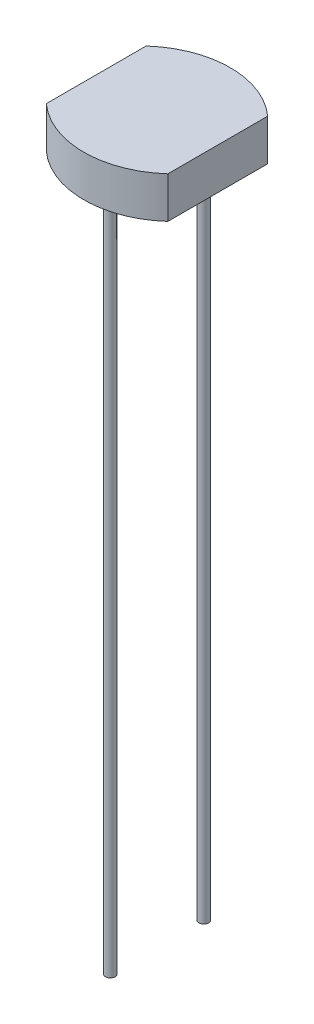
ISO-10303-21;
HEADER;
FILE_DESCRIPTION(('STEP AP214'),'2;1');
FILE_NAME('part.step','',(''),(''),'','','');
FILE_SCHEMA(('AUTOMOTIVE_DESIGN { 1 0 10303 214 1 1 1 1 }'));
ENDSEC;
DATA;
#1=APPLICATION_CONTEXT('core data for automotive mechanical design processes');
#2=APPLICATION_PROTOCOL_DEFINITION('international standard','automotive_design',2000,#1);
#3=PRODUCT_CONTEXT('',#1,'mechanical');
#4=PRODUCT('Part','Part','',(#3));
#5=PRODUCT_RELATED_PRODUCT_CATEGORY('part','',(#4));
#6=PRODUCT_DEFINITION_FORMATION('','',#4);
#7=PRODUCT_DEFINITION_CONTEXT('part definition',#1,'design');
#8=PRODUCT_DEFINITION('design','',#6,#7);
#9=PRODUCT_DEFINITION_SHAPE('','',#8);
#10=(LENGTH_UNIT() NAMED_UNIT(*) SI_UNIT(.MILLI.,.METRE.));
#11=(NAMED_UNIT(*) PLANE_ANGLE_UNIT() SI_UNIT($,.RADIAN.));
#12=(NAMED_UNIT(*) SI_UNIT($,.STERADIAN.) SOLID_ANGLE_UNIT());
#13=UNCERTAINTY_MEASURE_WITH_UNIT(LENGTH_MEASURE(1.E-05),#10,'distance_accuracy_value','');
#14=(GEOMETRIC_REPRESENTATION_CONTEXT(3) GLOBAL_UNCERTAINTY_ASSIGNED_CONTEXT((#13)) GLOBAL_UNIT_ASSIGNED_CONTEXT((#10,
#11,#12)) REPRESENTATION_CONTEXT('',''));
#15=CARTESIAN_POINT('',(0.,0.,0.));
#16=DIRECTION('',(0.,0.,1.));
#17=DIRECTION('',(1.,0.,0.));
#18=AXIS2_PLACEMENT_3D('',#15,#16,#17);
#19=CARTESIAN_POINT('',(2.80000000000001,1.9,0.));
#20=DIRECTION('',(-1.,0.,0.));
#21=DIRECTION('',(0.,0.,1.));
#22=AXIS2_PLACEMENT_3D('',#19,#20,#21);
#23=PLANE('',#22);
#24=DIRECTION('',(0.,0.,-1.));
#25=VECTOR('',#24,1.);
#26=CARTESIAN_POINT('',(2.80000000000001,0.,0.));
#27=LINE('',#26,#25);
#28=CARTESIAN_POINT('',(2.80000000000001,0.,2.29893702585345));
#29=VERTEX_POINT('',#28);
#30=CARTESIAN_POINT('',(2.80000000000001,0.,-2.29893702585345));
#31=VERTEX_POINT('',#30);
#32=EDGE_CURVE('E79',#29,#31,#27,.T.);
#33=ORIENTED_EDGE('',*,*,#32,.T.);
#34=DIRECTION('',(0.,-1.,0.));
#35=VECTOR('',#34,1.);
#36=CARTESIAN_POINT('',(2.80000000000001,1.9,-2.29893702585345));
#37=LINE('',#36,#35);
#38=CARTESIAN_POINT('',(2.80000000000001,1.9,-2.29893702585345));
#39=VERTEX_POINT('',#38);
#40=EDGE_CURVE('E42',#39,#31,#37,.T.);
#41=ORIENTED_EDGE('',*,*,#40,.F.);
#42=DIRECTION('',(0.,0.,-1.));
#43=VECTOR('',#42,1.);
#44=CARTESIAN_POINT('',(2.80000000000001,1.9,0.));
#45=LINE('',#44,#43);
#46=CARTESIAN_POINT('',(2.80000000000001,1.9,2.29893702585345));
#47=VERTEX_POINT('',#46);
#48=EDGE_CURVE('E70',#47,#39,#45,.T.);
#49=ORIENTED_EDGE('',*,*,#48,.F.);
#50=DIRECTION('',(0.,-1.,0.));
#51=VECTOR('',#50,1.);
#52=CARTESIAN_POINT('',(2.80000000000001,1.9,2.29893702585345));
#53=LINE('',#52,#51);
#54=EDGE_CURVE('E85',#47,#29,#53,.T.);
#55=ORIENTED_EDGE('',*,*,#54,.T.);
#56=EDGE_LOOP('',(#33,#41,#49,#55));
#57=FACE_BOUND('',#56,.T.);
#58=ADVANCED_FACE('F34',(#57),#23,.F.);
#59=CARTESIAN_POINT('',(0.,1.9,0.805940958156026));
#60=DIRECTION('',(0.,-1.,0.));
#61=DIRECTION('',(0.,0.,-1.));
#62=AXIS2_PLACEMENT_3D('',#59,#60,#61);
#63=CYLINDRICAL_SURFACE('',#62,4.18094095815604);
#64=CARTESIAN_POINT('',(0.,0.,0.805940958156026));
#65=DIRECTION('',(0.,1.,0.));
#66=DIRECTION('',(0.,0.,1.));
#67=AXIS2_PLACEMENT_3D('',#64,#65,#66);
#68=CIRCLE('',#67,4.18094095815604);
#69=CARTESIAN_POINT('',(-2.79999999999999,0.,-2.29893702585345));
#70=VERTEX_POINT('',#69);
#71=EDGE_CURVE('E61',#31,#70,#68,.T.);
#72=ORIENTED_EDGE('',*,*,#71,.T.);
#73=DIRECTION('',(0.,-1.,0.));
#74=VECTOR('',#73,1.);
#75=CARTESIAN_POINT('',(-2.79999999999999,1.9,-2.29893702585345));
#76=LINE('',#75,#74);
#77=CARTESIAN_POINT('',(-2.79999999999999,1.9,-2.29893702585345));
#78=VERTEX_POINT('',#77);
#79=EDGE_CURVE('E111',#78,#70,#76,.T.);
#80=ORIENTED_EDGE('',*,*,#79,.F.);
#81=CARTESIAN_POINT('',(0.,1.9,0.805940958156026));
#82=DIRECTION('',(0.,1.,0.));
#83=DIRECTION('',(0.,0.,1.));
#84=AXIS2_PLACEMENT_3D('',#81,#82,#83);
#85=CIRCLE('',#84,4.18094095815604);
#86=EDGE_CURVE('E50',#39,#78,#85,.T.);
#87=ORIENTED_EDGE('',*,*,#86,.F.);
#88=ORIENTED_EDGE('',*,*,#40,.T.);
#89=EDGE_LOOP('',(#72,#80,#87,#88));
#90=FACE_BOUND('',#89,.T.);
#91=ADVANCED_FACE('F116',(#90),#63,.T.);
#92=CARTESIAN_POINT('',(-2.79999999999999,1.9,0.));
#93=DIRECTION('',(-1.,0.,0.));
#94=DIRECTION('',(0.,0.,1.));
#95=AXIS2_PLACEMENT_3D('',#92,#93,#94);
#96=PLANE('',#95);
#97=DIRECTION('',(0.,0.,-1.));
#98=VECTOR('',#97,1.);
#99=CARTESIAN_POINT('',(-2.79999999999999,0.,0.));
#100=LINE('',#99,#98);
#101=CARTESIAN_POINT('',(-2.79999999999999,0.,2.29893702585345));
#102=VERTEX_POINT('',#101);
#103=EDGE_CURVE('E107',#102,#70,#100,.T.);
#104=ORIENTED_EDGE('',*,*,#103,.F.);
#105=DIRECTION('',(0.,-1.,0.));
#106=VECTOR('',#105,1.);
#107=CARTESIAN_POINT('',(-2.79999999999999,1.9,2.29893702585345));
#108=LINE('',#107,#106);
#109=CARTESIAN_POINT('',(-2.79999999999999,1.9,2.29893702585345));
#110=VERTEX_POINT('',#109);
#111=EDGE_CURVE('E89',#110,#102,#108,.T.);
#112=ORIENTED_EDGE('',*,*,#111,.F.);
#113=DIRECTION('',(0.,0.,-1.));
#114=VECTOR('',#113,1.);
#115=CARTESIAN_POINT('',(-2.79999999999999,1.9,0.));
#116=LINE('',#115,#114);
#117=EDGE_CURVE('E109',#110,#78,#116,.T.);
#118=ORIENTED_EDGE('',*,*,#117,.T.);
#119=ORIENTED_EDGE('',*,*,#79,.T.);
#120=EDGE_LOOP('',(#104,#112,#118,#119));
#121=FACE_BOUND('',#120,.T.);
#122=ADVANCED_FACE('F119',(#121),#96,.T.);
#123=CARTESIAN_POINT('',(0.,1.9,0.));
#124=DIRECTION('',(0.,1.,0.));
#125=DIRECTION('',(0.,0.,1.));
#126=AXIS2_PLACEMENT_3D('',#123,#124,#125);
#127=PLANE('',#126);
#128=ORIENTED_EDGE('',*,*,#48,.T.);
#129=ORIENTED_EDGE('',*,*,#86,.T.);
#130=ORIENTED_EDGE('',*,*,#117,.F.);
#131=CARTESIAN_POINT('',(0.,1.9,-0.805940958156026));
#132=DIRECTION('',(0.,-1.,0.));
#133=DIRECTION('',(0.,0.,-1.));
#134=AXIS2_PLACEMENT_3D('',#131,#132,#133);
#135=CIRCLE('',#134,4.18094095815604);
#136=EDGE_CURVE('E90',#47,#110,#135,.T.);
#137=ORIENTED_EDGE('',*,*,#136,.F.);
#138=EDGE_LOOP('',(#128,#129,#130,#137));
#139=FACE_BOUND('',#138,.T.);
#140=ADVANCED_FACE('F117',(#139),#127,.T.);
#141=CARTESIAN_POINT('',(0.,0.,0.));
#142=DIRECTION('',(0.,1.,0.));
#143=DIRECTION('',(0.,0.,1.));
#144=AXIS2_PLACEMENT_3D('',#141,#142,#143);
#145=PLANE('',#144);
#146=CARTESIAN_POINT('',(0.,0.,2.15000000000002));
#147=DIRECTION('',(0.,1.,0.));
#148=DIRECTION('',(0.,0.,1.));
#149=AXIS2_PLACEMENT_3D('',#146,#147,#148);
#150=CIRCLE('',#149,0.225);
#151=CARTESIAN_POINT('',(0.,0.,2.37500000000002));
#152=VERTEX_POINT('',#151);
#153=EDGE_CURVE('E99',#152,#152,#150,.T.);
#154=ORIENTED_EDGE('',*,*,#153,.T.);
#155=EDGE_LOOP('',(#154));
#156=FACE_BOUND('',#155,.T.);
#157=CARTESIAN_POINT('',(0.,0.,-2.15000000000002));
#158=DIRECTION('',(0.,1.,0.));
#159=DIRECTION('',(0.,0.,1.));
#160=AXIS2_PLACEMENT_3D('',#157,#158,#159);
#161=CIRCLE('',#160,0.225);
#162=CARTESIAN_POINT('',(0.,0.,-1.92500000000002));
#163=VERTEX_POINT('',#162);
#164=EDGE_CURVE('E11',#163,#163,#161,.F.);
#165=ORIENTED_EDGE('',*,*,#164,.F.);
#166=EDGE_LOOP('',(#165));
#167=FACE_BOUND('',#166,.T.);
#168=ORIENTED_EDGE('',*,*,#32,.F.);
#169=CARTESIAN_POINT('',(0.,0.,-0.805940958156026));
#170=DIRECTION('',(0.,-1.,0.));
#171=DIRECTION('',(0.,0.,-1.));
#172=AXIS2_PLACEMENT_3D('',#169,#170,#171);
#173=CIRCLE('',#172,4.18094095815604);
#174=EDGE_CURVE('E82',#29,#102,#173,.T.);
#175=ORIENTED_EDGE('',*,*,#174,.T.);
#176=ORIENTED_EDGE('',*,*,#103,.T.);
#177=ORIENTED_EDGE('',*,*,#71,.F.);
#178=EDGE_LOOP('',(#168,#175,#176,#177));
#179=FACE_BOUND('',#178,.T.);
#180=ADVANCED_FACE('F80',(#156,#167,#179),#145,.F.);
#181=CARTESIAN_POINT('',(0.,-31.5,-2.15000000000002));
#182=DIRECTION('',(0.,1.,0.));
#183=DIRECTION('',(0.,0.,1.));
#184=AXIS2_PLACEMENT_3D('',#181,#182,#183);
#185=CYLINDRICAL_SURFACE('',#184,0.225);
#186=CARTESIAN_POINT('',(0.,-31.5,-2.15000000000002));
#187=DIRECTION('',(0.,-1.,0.));
#188=DIRECTION('',(0.,0.,-1.));
#189=AXIS2_PLACEMENT_3D('',#186,#187,#188);
#190=CIRCLE('',#189,0.225);
#191=CARTESIAN_POINT('',(0.,-31.5,-2.37500000000002));
#192=VERTEX_POINT('',#191);
#193=EDGE_CURVE('E83',#192,#192,#190,.T.);
#194=ORIENTED_EDGE('',*,*,#193,.F.);
#195=EDGE_LOOP('',(#194));
#196=FACE_BOUND('',#195,.T.);
#197=ORIENTED_EDGE('',*,*,#164,.T.);
#198=EDGE_LOOP('',(#197));
#199=FACE_BOUND('',#198,.T.);
#200=ADVANCED_FACE('F143',(#196,#199),#185,.T.);
#201=CARTESIAN_POINT('',(0.,-31.5,-2.15000000000002));
#202=DIRECTION('',(0.,-1.,0.));
#203=DIRECTION('',(0.,0.,-1.));
#204=AXIS2_PLACEMENT_3D('',#201,#202,#203);
#205=PLANE('',#204);
#206=ORIENTED_EDGE('',*,*,#193,.T.);
#207=EDGE_LOOP('',(#206));
#208=FACE_BOUND('',#207,.T.);
#209=ADVANCED_FACE('F147',(#208),#205,.T.);
#210=CARTESIAN_POINT('',(0.,1.9,-0.805940958156026));
#211=DIRECTION('',(0.,-1.,0.));
#212=DIRECTION('',(0.,0.,-1.));
#213=AXIS2_PLACEMENT_3D('',#210,#211,#212);
#214=CYLINDRICAL_SURFACE('',#213,4.18094095815604);
#215=ORIENTED_EDGE('',*,*,#174,.F.);
#216=ORIENTED_EDGE('',*,*,#54,.F.);
#217=ORIENTED_EDGE('',*,*,#136,.T.);
#218=ORIENTED_EDGE('',*,*,#111,.T.);
#219=EDGE_LOOP('',(#215,#216,#217,#218));
#220=FACE_BOUND('',#219,.T.);
#221=ADVANCED_FACE('F93',(#220),#214,.T.);
#222=CARTESIAN_POINT('',(0.,-31.5,2.15000000000002));
#223=DIRECTION('',(0.,1.,0.));
#224=DIRECTION('',(0.,0.,1.));
#225=AXIS2_PLACEMENT_3D('',#222,#223,#224);
#226=CYLINDRICAL_SURFACE('',#225,0.225);
#227=CARTESIAN_POINT('',(0.,-31.5,2.15000000000002));
#228=DIRECTION('',(0.,1.,0.));
#229=DIRECTION('',(0.,0.,1.));
#230=AXIS2_PLACEMENT_3D('',#227,#228,#229);
#231=CIRCLE('',#230,0.225);
#232=CARTESIAN_POINT('',(0.,-31.5,2.37500000000002));
#233=VERTEX_POINT('',#232);
#234=EDGE_CURVE('E95',#233,#233,#231,.T.);
#235=ORIENTED_EDGE('',*,*,#234,.T.);
#236=EDGE_LOOP('',(#235));
#237=FACE_BOUND('',#236,.T.);
#238=ORIENTED_EDGE('',*,*,#153,.F.);
#239=EDGE_LOOP('',(#238));
#240=FACE_BOUND('',#239,.T.);
#241=ADVANCED_FACE('F167',(#237,#240),#226,.T.);
#242=CARTESIAN_POINT('',(0.,-31.5,2.15000000000002));
#243=DIRECTION('',(0.,-1.,0.));
#244=DIRECTION('',(0.,0.,1.));
#245=AXIS2_PLACEMENT_3D('',#242,#243,#244);
#246=PLANE('',#245);
#247=ORIENTED_EDGE('',*,*,#234,.F.);
#248=EDGE_LOOP('',(#247));
#249=FACE_BOUND('',#248,.T.);
#250=ADVANCED_FACE('F175',(#249),#246,.T.);
#251=CLOSED_SHELL('',(#58,#91,#122,#140,#180,#200,#209,#221,#241,#250));
#252=MANIFOLD_SOLID_BREP('B2',#251);
#253=ADVANCED_BREP_SHAPE_REPRESENTATION('',(#18,#252),#14);
#254=SHAPE_DEFINITION_REPRESENTATION(#9,#253);
ENDSEC;
END-ISO-10303-21;
